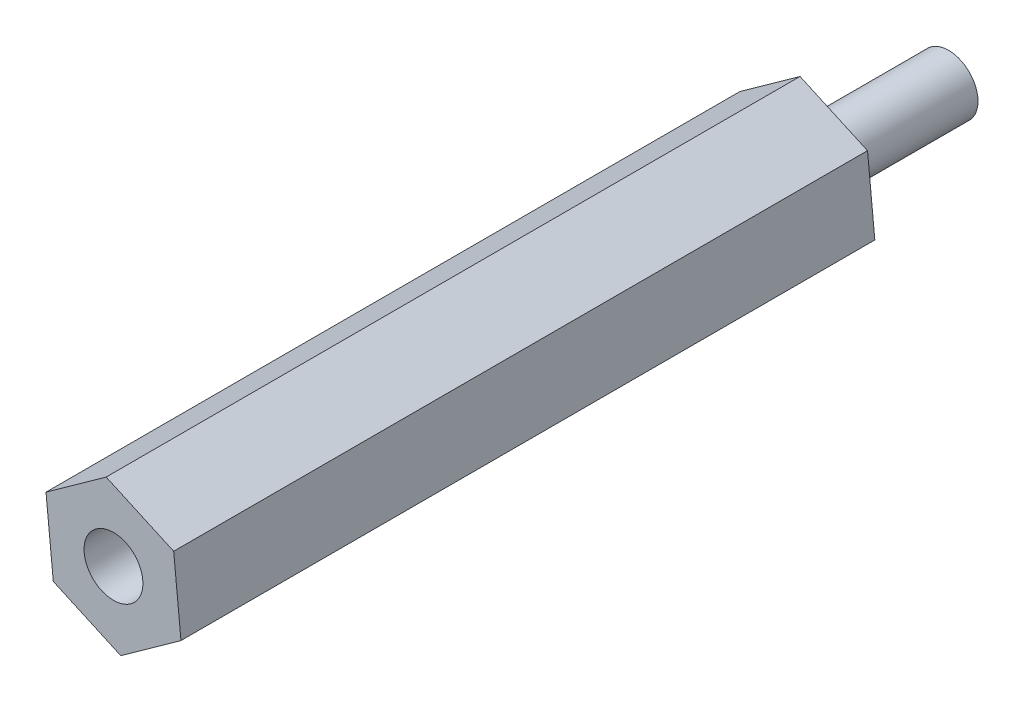
ISO-10303-21;
HEADER;
FILE_DESCRIPTION(('STEP AP214'),'2;1');
FILE_NAME('part.step','',(''),(''),'','','');
FILE_SCHEMA(('AUTOMOTIVE_DESIGN { 1 0 10303 214 1 1 1 1 }'));
ENDSEC;
DATA;
#1=APPLICATION_CONTEXT('core data for automotive mechanical design processes');
#2=APPLICATION_PROTOCOL_DEFINITION('international standard','automotive_design',2000,#1);
#3=PRODUCT_CONTEXT('',#1,'mechanical');
#4=PRODUCT('Part','Part','',(#3));
#5=PRODUCT_RELATED_PRODUCT_CATEGORY('part','',(#4));
#6=PRODUCT_DEFINITION_FORMATION('','',#4);
#7=PRODUCT_DEFINITION_CONTEXT('part definition',#1,'design');
#8=PRODUCT_DEFINITION('design','',#6,#7);
#9=PRODUCT_DEFINITION_SHAPE('','',#8);
#10=(LENGTH_UNIT() NAMED_UNIT(*) SI_UNIT(.MILLI.,.METRE.));
#11=(NAMED_UNIT(*) PLANE_ANGLE_UNIT() SI_UNIT($,.RADIAN.));
#12=(NAMED_UNIT(*) SI_UNIT($,.STERADIAN.) SOLID_ANGLE_UNIT());
#13=UNCERTAINTY_MEASURE_WITH_UNIT(LENGTH_MEASURE(1.E-05),#10,'distance_accuracy_value','');
#14=(GEOMETRIC_REPRESENTATION_CONTEXT(3) GLOBAL_UNCERTAINTY_ASSIGNED_CONTEXT((#13)) GLOBAL_UNIT_ASSIGNED_CONTEXT((#10,
#11,#12)) REPRESENTATION_CONTEXT('',''));
#15=CARTESIAN_POINT('',(0.,0.,0.));
#16=DIRECTION('',(0.,0.,1.));
#17=DIRECTION('',(1.,0.,0.));
#18=AXIS2_PLACEMENT_3D('',#15,#16,#17);
#19=CARTESIAN_POINT('',(0.,0.,0.));
#20=DIRECTION('',(0.,0.,1.));
#21=DIRECTION('',(1.,0.,0.));
#22=AXIS2_PLACEMENT_3D('',#19,#20,#21);
#23=PLANE('',#22);
#24=DIRECTION('',(0.098543902892377,-0.99513270431774,0.));
#25=VECTOR('',#24,1.);
#26=CARTESIAN_POINT('',(-2.9126420994332,1.31784316743035,0.));
#27=LINE('',#26,#25);
#28=CARTESIAN_POINT('',(-2.9126420994332,1.31784316743035,0.));
#29=VERTEX_POINT('',#28);
#30=CARTESIAN_POINT('',(-2.59760671091503,-1.86350046652602,0.));
#31=VERTEX_POINT('',#30);
#32=EDGE_CURVE('E121',#29,#31,#27,.T.);
#33=ORIENTED_EDGE('',*,*,#32,.F.);
#34=DIRECTION('',(-0.812538250629682,-0.582907875451735,0.));
#35=VECTOR('',#34,1.);
#36=CARTESIAN_POINT('',(-0.315035388518172,3.18134363395637,0.));
#37=LINE('',#36,#35);
#38=CARTESIAN_POINT('',(-0.315035388518172,3.18134363395637,0.));
#39=VERTEX_POINT('',#38);
#40=EDGE_CURVE('E81',#39,#29,#37,.T.);
#41=ORIENTED_EDGE('',*,*,#40,.F.);
#42=DIRECTION('',(-0.911082153522059,0.412224828866005,0.));
#43=VECTOR('',#42,1.);
#44=CARTESIAN_POINT('',(2.59760671091503,1.86350046652602,0.));
#45=LINE('',#44,#43);
#46=CARTESIAN_POINT('',(2.59760671091503,1.86350046652602,0.));
#47=VERTEX_POINT('',#46);
#48=EDGE_CURVE('E75',#47,#39,#45,.T.);
#49=ORIENTED_EDGE('',*,*,#48,.F.);
#50=DIRECTION('',(-0.0985439028923772,0.99513270431774,0.));
#51=VECTOR('',#50,1.);
#52=CARTESIAN_POINT('',(2.9126420994332,-1.31784316743035,0.));
#53=LINE('',#52,#51);
#54=CARTESIAN_POINT('',(2.9126420994332,-1.31784316743035,0.));
#55=VERTEX_POINT('',#54);
#56=EDGE_CURVE('E111',#55,#47,#53,.T.);
#57=ORIENTED_EDGE('',*,*,#56,.F.);
#58=DIRECTION('',(0.812538250629682,0.582907875451735,0.));
#59=VECTOR('',#58,1.);
#60=CARTESIAN_POINT('',(0.315035388518171,-3.18134363395637,0.));
#61=LINE('',#60,#59);
#62=CARTESIAN_POINT('',(0.315035388518171,-3.18134363395637,0.));
#63=VERTEX_POINT('',#62);
#64=EDGE_CURVE('E127',#63,#55,#61,.T.);
#65=ORIENTED_EDGE('',*,*,#64,.F.);
#66=DIRECTION('',(0.911082153522059,-0.412224828866004,0.));
#67=VECTOR('',#66,1.);
#68=CARTESIAN_POINT('',(-2.59760671091503,-1.86350046652602,0.));
#69=LINE('',#68,#67);
#70=EDGE_CURVE('E124',#31,#63,#69,.T.);
#71=ORIENTED_EDGE('',*,*,#70,.F.);
#72=EDGE_LOOP('',(#33,#41,#49,#57,#65,#71));
#73=FACE_BOUND('',#72,.T.);
#74=CARTESIAN_POINT('',(0.,0.,0.));
#75=DIRECTION('',(0.,0.,1.));
#76=DIRECTION('',(1.,0.,0.));
#77=AXIS2_PLACEMENT_3D('',#74,#75,#76);
#78=CIRCLE('',#77,1.27);
#79=CARTESIAN_POINT('',(1.27,0.,0.));
#80=VERTEX_POINT('',#79);
#81=EDGE_CURVE('E11',#80,#80,#78,.F.);
#82=ORIENTED_EDGE('',*,*,#81,.F.);
#83=EDGE_LOOP('',(#82));
#84=FACE_BOUND('',#83,.T.);
#85=ADVANCED_FACE('F35',(#73,#84),#23,.F.);
#86=CARTESIAN_POINT('',(-2.9126420994332,1.31784316743035,29.9466));
#87=DIRECTION('',(0.995132704317739,0.0985439028923769,0.));
#88=DIRECTION('',(-0.098543902892377,0.99513270431774,0.));
#89=AXIS2_PLACEMENT_3D('',#86,#87,#88);
#90=PLANE('',#89);
#91=ORIENTED_EDGE('',*,*,#32,.T.);
#92=DIRECTION('',(0.,0.,-1.));
#93=VECTOR('',#92,1.);
#94=CARTESIAN_POINT('',(-2.59760671091503,-1.86350046652602,29.9466));
#95=LINE('',#94,#93);
#96=CARTESIAN_POINT('',(-2.59760671091503,-1.86350046652602,29.9466));
#97=VERTEX_POINT('',#96);
#98=EDGE_CURVE('E44',#97,#31,#95,.T.);
#99=ORIENTED_EDGE('',*,*,#98,.F.);
#100=DIRECTION('',(0.098543902892377,-0.99513270431774,0.));
#101=VECTOR('',#100,1.);
#102=CARTESIAN_POINT('',(-2.9126420994332,1.31784316743035,29.9466));
#103=LINE('',#102,#101);
#104=CARTESIAN_POINT('',(-2.9126420994332,1.31784316743035,29.9466));
#105=VERTEX_POINT('',#104);
#106=EDGE_CURVE('E132',#105,#97,#103,.T.);
#107=ORIENTED_EDGE('',*,*,#106,.F.);
#108=DIRECTION('',(0.,0.,-1.));
#109=VECTOR('',#108,1.);
#110=CARTESIAN_POINT('',(-2.9126420994332,1.31784316743035,29.9466));
#111=LINE('',#110,#109);
#112=EDGE_CURVE('E117',#105,#29,#111,.T.);
#113=ORIENTED_EDGE('',*,*,#112,.T.);
#114=EDGE_LOOP('',(#91,#99,#107,#113));
#115=FACE_BOUND('',#114,.T.);
#116=ADVANCED_FACE('F37',(#115),#90,.F.);
#117=CARTESIAN_POINT('',(-2.59760671091503,-1.86350046652602,29.9466));
#118=DIRECTION('',(0.412224828866004,0.911082153522059,0.));
#119=DIRECTION('',(-0.911082153522059,0.412224828866004,0.));
#120=AXIS2_PLACEMENT_3D('',#117,#118,#119);
#121=PLANE('',#120);
#122=ORIENTED_EDGE('',*,*,#70,.T.);
#123=DIRECTION('',(0.,0.,-1.));
#124=VECTOR('',#123,1.);
#125=CARTESIAN_POINT('',(0.315035388518171,-3.18134363395637,29.9466));
#126=LINE('',#125,#124);
#127=CARTESIAN_POINT('',(0.315035388518171,-3.18134363395637,29.9466));
#128=VERTEX_POINT('',#127);
#129=EDGE_CURVE('E136',#128,#63,#126,.T.);
#130=ORIENTED_EDGE('',*,*,#129,.F.);
#131=DIRECTION('',(0.911082153522059,-0.412224828866004,0.));
#132=VECTOR('',#131,1.);
#133=CARTESIAN_POINT('',(-2.59760671091503,-1.86350046652602,29.9466));
#134=LINE('',#133,#132);
#135=EDGE_CURVE('E90',#97,#128,#134,.T.);
#136=ORIENTED_EDGE('',*,*,#135,.F.);
#137=ORIENTED_EDGE('',*,*,#98,.T.);
#138=EDGE_LOOP('',(#122,#130,#136,#137));
#139=FACE_BOUND('',#138,.T.);
#140=ADVANCED_FACE('F139',(#139),#121,.F.);
#141=CARTESIAN_POINT('',(0.315035388518171,-3.18134363395637,29.9466));
#142=DIRECTION('',(-0.582907875451735,0.812538250629682,0.));
#143=DIRECTION('',(-0.812538250629683,-0.582907875451735,0.));
#144=AXIS2_PLACEMENT_3D('',#141,#142,#143);
#145=PLANE('',#144);
#146=ORIENTED_EDGE('',*,*,#64,.T.);
#147=DIRECTION('',(0.,0.,-1.));
#148=VECTOR('',#147,1.);
#149=CARTESIAN_POINT('',(2.9126420994332,-1.31784316743035,29.9466));
#150=LINE('',#149,#148);
#151=CARTESIAN_POINT('',(2.9126420994332,-1.31784316743035,29.9466));
#152=VERTEX_POINT('',#151);
#153=EDGE_CURVE('E112',#152,#55,#150,.T.);
#154=ORIENTED_EDGE('',*,*,#153,.F.);
#155=DIRECTION('',(0.812538250629682,0.582907875451735,0.));
#156=VECTOR('',#155,1.);
#157=CARTESIAN_POINT('',(0.315035388518171,-3.18134363395637,29.9466));
#158=LINE('',#157,#156);
#159=EDGE_CURVE('E103',#128,#152,#158,.T.);
#160=ORIENTED_EDGE('',*,*,#159,.F.);
#161=ORIENTED_EDGE('',*,*,#129,.T.);
#162=EDGE_LOOP('',(#146,#154,#160,#161));
#163=FACE_BOUND('',#162,.T.);
#164=ADVANCED_FACE('F147',(#163),#145,.F.);
#165=CARTESIAN_POINT('',(2.9126420994332,-1.31784316743035,29.9466));
#166=DIRECTION('',(-0.99513270431774,-0.0985439028923772,0.));
#167=DIRECTION('',(0.0985439028923772,-0.99513270431774,0.));
#168=AXIS2_PLACEMENT_3D('',#165,#166,#167);
#169=PLANE('',#168);
#170=ORIENTED_EDGE('',*,*,#56,.T.);
#171=DIRECTION('',(0.,0.,-1.));
#172=VECTOR('',#171,1.);
#173=CARTESIAN_POINT('',(2.59760671091503,1.86350046652602,29.9466));
#174=LINE('',#173,#172);
#175=CARTESIAN_POINT('',(2.59760671091503,1.86350046652602,29.9466));
#176=VERTEX_POINT('',#175);
#177=EDGE_CURVE('E108',#176,#47,#174,.T.);
#178=ORIENTED_EDGE('',*,*,#177,.F.);
#179=DIRECTION('',(-0.0985439028923772,0.99513270431774,0.));
#180=VECTOR('',#179,1.);
#181=CARTESIAN_POINT('',(2.9126420994332,-1.31784316743035,29.9466));
#182=LINE('',#181,#180);
#183=EDGE_CURVE('E97',#152,#176,#182,.T.);
#184=ORIENTED_EDGE('',*,*,#183,.F.);
#185=ORIENTED_EDGE('',*,*,#153,.T.);
#186=EDGE_LOOP('',(#170,#178,#184,#185));
#187=FACE_BOUND('',#186,.T.);
#188=ADVANCED_FACE('F109',(#187),#169,.F.);
#189=CARTESIAN_POINT('',(2.59760671091503,1.86350046652602,29.9466));
#190=DIRECTION('',(-0.412224828866005,-0.911082153522059,0.));
#191=DIRECTION('',(0.911082153522059,-0.412224828866005,0.));
#192=AXIS2_PLACEMENT_3D('',#189,#190,#191);
#193=PLANE('',#192);
#194=ORIENTED_EDGE('',*,*,#48,.T.);
#195=DIRECTION('',(0.,0.,-1.));
#196=VECTOR('',#195,1.);
#197=CARTESIAN_POINT('',(-0.315035388518172,3.18134363395637,29.9466));
#198=LINE('',#197,#196);
#199=CARTESIAN_POINT('',(-0.315035388518172,3.18134363395637,29.9466));
#200=VERTEX_POINT('',#199);
#201=EDGE_CURVE('E113',#200,#39,#198,.T.);
#202=ORIENTED_EDGE('',*,*,#201,.F.);
#203=DIRECTION('',(-0.911082153522059,0.412224828866005,0.));
#204=VECTOR('',#203,1.);
#205=CARTESIAN_POINT('',(2.59760671091503,1.86350046652602,29.9466));
#206=LINE('',#205,#204);
#207=EDGE_CURVE('E101',#176,#200,#206,.T.);
#208=ORIENTED_EDGE('',*,*,#207,.F.);
#209=ORIENTED_EDGE('',*,*,#177,.T.);
#210=EDGE_LOOP('',(#194,#202,#208,#209));
#211=FACE_BOUND('',#210,.T.);
#212=ADVANCED_FACE('F115',(#211),#193,.F.);
#213=CARTESIAN_POINT('',(-0.315035388518172,3.18134363395637,29.9466));
#214=DIRECTION('',(0.582907875451735,-0.812538250629682,0.));
#215=DIRECTION('',(0.812538250629682,0.582907875451735,0.));
#216=AXIS2_PLACEMENT_3D('',#213,#214,#215);
#217=PLANE('',#216);
#218=ORIENTED_EDGE('',*,*,#40,.T.);
#219=ORIENTED_EDGE('',*,*,#112,.F.);
#220=DIRECTION('',(-0.812538250629682,-0.582907875451735,0.));
#221=VECTOR('',#220,1.);
#222=CARTESIAN_POINT('',(-0.315035388518172,3.18134363395637,29.9466));
#223=LINE('',#222,#221);
#224=EDGE_CURVE('E52',#200,#105,#223,.T.);
#225=ORIENTED_EDGE('',*,*,#224,.F.);
#226=ORIENTED_EDGE('',*,*,#201,.T.);
#227=EDGE_LOOP('',(#218,#219,#225,#226));
#228=FACE_BOUND('',#227,.T.);
#229=ADVANCED_FACE('F176',(#228),#217,.F.);
#230=CARTESIAN_POINT('',(0.,0.,29.9466));
#231=DIRECTION('',(0.,0.,1.));
#232=DIRECTION('',(1.,0.,0.));
#233=AXIS2_PLACEMENT_3D('',#230,#231,#232);
#234=PLANE('',#233);
#235=CARTESIAN_POINT('',(0.,0.,29.9466));
#236=DIRECTION('',(0.,0.,1.));
#237=DIRECTION('',(1.,0.,0.));
#238=AXIS2_PLACEMENT_3D('',#235,#236,#237);
#239=CIRCLE('',#238,1.27);
#240=CARTESIAN_POINT('',(1.27,0.,29.9466));
#241=VERTEX_POINT('',#240);
#242=EDGE_CURVE('E151',#241,#241,#239,.T.);
#243=ORIENTED_EDGE('',*,*,#242,.F.);
#244=EDGE_LOOP('',(#243));
#245=FACE_BOUND('',#244,.T.);
#246=ORIENTED_EDGE('',*,*,#106,.T.);
#247=ORIENTED_EDGE('',*,*,#135,.T.);
#248=ORIENTED_EDGE('',*,*,#159,.T.);
#249=ORIENTED_EDGE('',*,*,#183,.T.);
#250=ORIENTED_EDGE('',*,*,#207,.T.);
#251=ORIENTED_EDGE('',*,*,#224,.T.);
#252=EDGE_LOOP('',(#246,#247,#248,#249,#250,#251));
#253=FACE_BOUND('',#252,.T.);
#254=ADVANCED_FACE('F99',(#245,#253),#234,.T.);
#255=CARTESIAN_POINT('',(0.,0.,5.08));
#256=DIRECTION('',(0.,0.,1.));
#257=DIRECTION('',(1.,0.,0.));
#258=AXIS2_PLACEMENT_3D('',#255,#256,#257);
#259=CYLINDRICAL_SURFACE('',#258,1.27);
#260=CARTESIAN_POINT('',(0.,0.,5.08));
#261=DIRECTION('',(0.,0.,1.));
#262=DIRECTION('',(1.,0.,0.));
#263=AXIS2_PLACEMENT_3D('',#260,#261,#262);
#264=CIRCLE('',#263,1.27);
#265=CARTESIAN_POINT('',(1.27,0.,5.08));
#266=VERTEX_POINT('',#265);
#267=EDGE_CURVE('E125',#266,#266,#264,.T.);
#268=ORIENTED_EDGE('',*,*,#267,.F.);
#269=EDGE_LOOP('',(#268));
#270=FACE_BOUND('',#269,.T.);
#271=ORIENTED_EDGE('',*,*,#242,.T.);
#272=EDGE_LOOP('',(#271));
#273=FACE_BOUND('',#272,.T.);
#274=ADVANCED_FACE('F211',(#270,#273),#259,.F.);
#275=CARTESIAN_POINT('',(0.,0.,5.08));
#276=DIRECTION('',(0.,0.,1.));
#277=DIRECTION('',(1.,0.,0.));
#278=AXIS2_PLACEMENT_3D('',#275,#276,#277);
#279=PLANE('',#278);
#280=ORIENTED_EDGE('',*,*,#267,.T.);
#281=EDGE_LOOP('',(#280));
#282=FACE_BOUND('',#281,.T.);
#283=ADVANCED_FACE('F165',(#282),#279,.T.);
#284=CARTESIAN_POINT('',(0.,0.,-6.096));
#285=DIRECTION('',(0.,0.,1.));
#286=DIRECTION('',(1.,0.,0.));
#287=AXIS2_PLACEMENT_3D('',#284,#285,#286);
#288=CYLINDRICAL_SURFACE('',#287,1.27);
#289=CARTESIAN_POINT('',(0.,0.,-6.096));
#290=DIRECTION('',(0.,0.,-1.));
#291=DIRECTION('',(-1.,0.,0.));
#292=AXIS2_PLACEMENT_3D('',#289,#290,#291);
#293=CIRCLE('',#292,1.27);
#294=CARTESIAN_POINT('',(1.27,0.,-6.096));
#295=VERTEX_POINT('',#294);
#296=EDGE_CURVE('E154',#295,#295,#293,.T.);
#297=CARTESIAN_POINT('',(1.27,0.,-6.096));
#298=CARTESIAN_POINT('',(1.27,0.,-6.0325));
#299=CARTESIAN_POINT('',(1.27,0.,-5.969));
#300=CARTESIAN_POINT('',(1.27,0.,-5.842));
#301=CARTESIAN_POINT('',(1.27,0.,-5.7785));
#302=CARTESIAN_POINT('',(1.27,0.,-5.6515));
#303=CARTESIAN_POINT('',(1.27,0.,-5.588));
#304=CARTESIAN_POINT('',(1.27,0.,-5.461));
#305=CARTESIAN_POINT('',(1.27,0.,-5.3975));
#306=CARTESIAN_POINT('',(1.27,0.,-5.2705));
#307=CARTESIAN_POINT('',(1.27,0.,-5.207));
#308=CARTESIAN_POINT('',(1.27,0.,-5.08));
#309=CARTESIAN_POINT('',(1.27,0.,-5.0165));
#310=CARTESIAN_POINT('',(1.27,0.,-4.8895));
#311=CARTESIAN_POINT('',(1.27,0.,-4.826));
#312=CARTESIAN_POINT('',(1.27,0.,-4.699));
#313=CARTESIAN_POINT('',(1.27,0.,-4.6355));
#314=CARTESIAN_POINT('',(1.27,0.,-4.5085));
#315=CARTESIAN_POINT('',(1.27,0.,-4.445));
#316=CARTESIAN_POINT('',(1.27,0.,-4.318));
#317=CARTESIAN_POINT('',(1.27,0.,-4.2545));
#318=CARTESIAN_POINT('',(1.27,0.,-4.1275));
#319=CARTESIAN_POINT('',(1.27,0.,-4.064));
#320=CARTESIAN_POINT('',(1.27,0.,-3.937));
#321=CARTESIAN_POINT('',(1.27,0.,-3.8735));
#322=CARTESIAN_POINT('',(1.27,0.,-3.7465));
#323=CARTESIAN_POINT('',(1.27,0.,-3.683));
#324=CARTESIAN_POINT('',(1.27,0.,-3.556));
#325=CARTESIAN_POINT('',(1.27,0.,-3.4925));
#326=CARTESIAN_POINT('',(1.27,0.,-3.3655));
#327=CARTESIAN_POINT('',(1.27,0.,-3.302));
#328=CARTESIAN_POINT('',(1.27,0.,-3.175));
#329=CARTESIAN_POINT('',(1.27,0.,-3.1115));
#330=CARTESIAN_POINT('',(1.27,0.,-2.9845));
#331=CARTESIAN_POINT('',(1.27,0.,-2.921));
#332=CARTESIAN_POINT('',(1.27,0.,-2.794));
#333=CARTESIAN_POINT('',(1.27,0.,-2.7305));
#334=CARTESIAN_POINT('',(1.27,0.,-2.6035));
#335=CARTESIAN_POINT('',(1.27,0.,-2.54));
#336=CARTESIAN_POINT('',(1.27,0.,-2.413));
#337=CARTESIAN_POINT('',(1.27,0.,-2.3495));
#338=CARTESIAN_POINT('',(1.27,0.,-2.2225));
#339=CARTESIAN_POINT('',(1.27,0.,-2.159));
#340=CARTESIAN_POINT('',(1.27,0.,-2.032));
#341=CARTESIAN_POINT('',(1.27,0.,-1.9685));
#342=CARTESIAN_POINT('',(1.27,0.,-1.8415));
#343=CARTESIAN_POINT('',(1.27,0.,-1.778));
#344=CARTESIAN_POINT('',(1.27,0.,-1.651));
#345=CARTESIAN_POINT('',(1.27,0.,-1.5875));
#346=CARTESIAN_POINT('',(1.27,0.,-1.4605));
#347=CARTESIAN_POINT('',(1.27,0.,-1.397));
#348=CARTESIAN_POINT('',(1.27,0.,-1.27));
#349=CARTESIAN_POINT('',(1.27,0.,-1.2065));
#350=CARTESIAN_POINT('',(1.27,0.,-1.0795));
#351=CARTESIAN_POINT('',(1.27,0.,-1.016));
#352=CARTESIAN_POINT('',(1.27,0.,-0.889));
#353=CARTESIAN_POINT('',(1.27,0.,-0.8255));
#354=CARTESIAN_POINT('',(1.27,0.,-0.6985));
#355=CARTESIAN_POINT('',(1.27,0.,-0.635));
#356=CARTESIAN_POINT('',(1.27,0.,-0.508));
#357=CARTESIAN_POINT('',(1.27,0.,-0.4445));
#358=CARTESIAN_POINT('',(1.27,0.,-0.3175));
#359=CARTESIAN_POINT('',(1.27,0.,-0.254));
#360=CARTESIAN_POINT('',(1.27,0.,-0.127));
#361=CARTESIAN_POINT('',(1.27,0.,-0.0634999999999999));
#362=CARTESIAN_POINT('',(1.27,0.,0.));
#363=B_SPLINE_CURVE_WITH_KNOTS('',3,(#297,#298,#299,#300,#301,#302,#303,#304,#305,#306,#307,
#308,#309,#310,#311,#312,#313,#314,#315,#316,#317,#318,#319,#320,#321,#322,#323,#324,#325,#326,
#327,#328,#329,#330,#331,#332,#333,#334,#335,#336,#337,#338,#339,#340,#341,#342,#343,#344,#345,
#346,#347,#348,#349,#350,#351,#352,#353,#354,#355,#356,#357,#358,#359,#360,#361,#362),
.UNSPECIFIED.,.F.,.F.,(4,2,2,2,2,2,2,2,2,2,2,2,2,2,2,2,2,2,2,2,2,2,2,2,2,2,2,2,2,2,2,2,4),(0.,
0.190500000000001,0.381,0.5715,0.762000000000001,0.9525,1.143,1.3335,1.524,1.7145,1.905,2.0955,
2.286,2.4765,2.667,2.8575,3.048,3.2385,3.429,3.6195,3.81,4.0005,4.191,4.3815,4.572,4.7625,4.953,
5.1435,5.334,5.5245,5.715,5.9055,6.096),.UNSPECIFIED.);
#364=EDGE_CURVE('BSEAM162',#295,#80,#363,.T.);
#365=ORIENTED_EDGE('',*,*,#296,.F.);
#366=ORIENTED_EDGE('',*,*,#81,.T.);
#367=ORIENTED_EDGE('',*,*,#364,.T.);
#368=ORIENTED_EDGE('',*,*,#364,.F.);
#369=EDGE_LOOP('',(#365,#367,#366,#368));
#370=FACE_BOUND('',#369,.T.);
#371=ADVANCED_FACE('F162',(#370),#288,.T.);
#372=CARTESIAN_POINT('',(0.,0.,-6.096));
#373=DIRECTION('',(0.,0.,-1.));
#374=DIRECTION('',(-1.,0.,0.));
#375=AXIS2_PLACEMENT_3D('',#372,#373,#374);
#376=PLANE('',#375);
#377=ORIENTED_EDGE('',*,*,#296,.T.);
#378=EDGE_LOOP('',(#377));
#379=FACE_BOUND('',#378,.T.);
#380=ADVANCED_FACE('F160',(#379),#376,.T.);
#381=CLOSED_SHELL('',(#85,#116,#140,#164,#188,#212,#229,#254,#274,#283,#371,#380));
#382=MANIFOLD_SOLID_BREP('B2',#381);
#383=ADVANCED_BREP_SHAPE_REPRESENTATION('',(#18,#382),#14);
#384=SHAPE_DEFINITION_REPRESENTATION(#9,#383);
ENDSEC;
END-ISO-10303-21;
